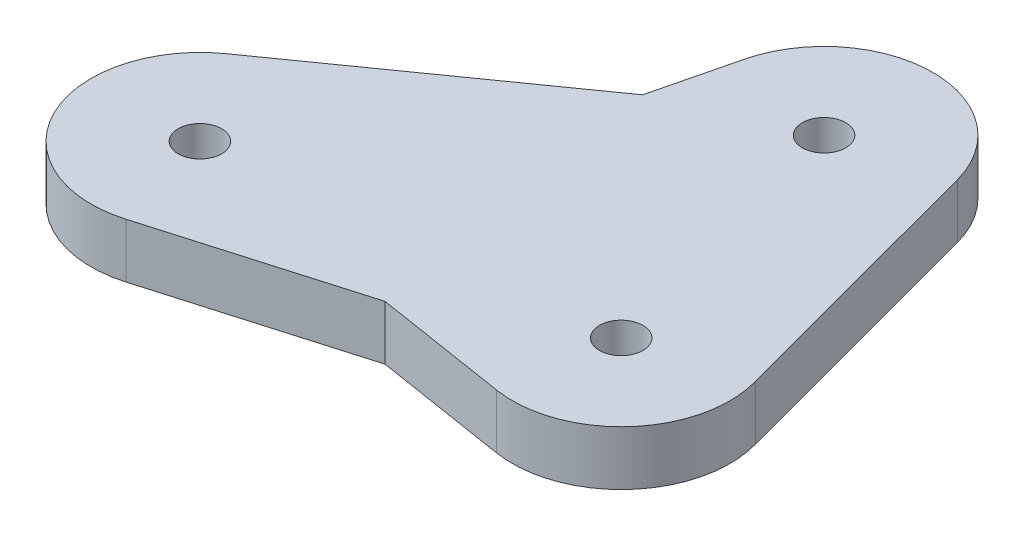
ISO-10303-21;
HEADER;
FILE_DESCRIPTION(('STEP AP214'),'2;1');
FILE_NAME('part.step','',(''),(''),'','','');
FILE_SCHEMA(('AUTOMOTIVE_DESIGN { 1 0 10303 214 1 1 1 1 }'));
ENDSEC;
DATA;
#1=APPLICATION_CONTEXT('core data for automotive mechanical design processes');
#2=APPLICATION_PROTOCOL_DEFINITION('international standard','automotive_design',2000,#1);
#3=PRODUCT_CONTEXT('',#1,'mechanical');
#4=PRODUCT('Part','Part','',(#3));
#5=PRODUCT_RELATED_PRODUCT_CATEGORY('part','',(#4));
#6=PRODUCT_DEFINITION_FORMATION('','',#4);
#7=PRODUCT_DEFINITION_CONTEXT('part definition',#1,'design');
#8=PRODUCT_DEFINITION('design','',#6,#7);
#9=PRODUCT_DEFINITION_SHAPE('','',#8);
#10=(LENGTH_UNIT() NAMED_UNIT(*) SI_UNIT(.MILLI.,.METRE.));
#11=(NAMED_UNIT(*) PLANE_ANGLE_UNIT() SI_UNIT($,.RADIAN.));
#12=(NAMED_UNIT(*) SI_UNIT($,.STERADIAN.) SOLID_ANGLE_UNIT());
#13=UNCERTAINTY_MEASURE_WITH_UNIT(LENGTH_MEASURE(1.E-05),#10,'distance_accuracy_value','');
#14=(GEOMETRIC_REPRESENTATION_CONTEXT(3) GLOBAL_UNCERTAINTY_ASSIGNED_CONTEXT((#13)) GLOBAL_UNIT_ASSIGNED_CONTEXT((#10,
#11,#12)) REPRESENTATION_CONTEXT('',''));
#15=CARTESIAN_POINT('',(0.,0.,0.));
#16=DIRECTION('',(0.,0.,1.));
#17=DIRECTION('',(1.,0.,0.));
#18=AXIS2_PLACEMENT_3D('',#15,#16,#17);
#19=CARTESIAN_POINT('',(-12.4473232729435,5.,7.18830522239326));
#20=DIRECTION('',(0.,-1.,0.));
#21=DIRECTION('',(0.,0.,-1.));
#22=AXIS2_PLACEMENT_3D('',#19,#20,#21);
#23=CYLINDRICAL_SURFACE('',#22,10.);
#24=CARTESIAN_POINT('',(-12.4473232729435,0.,7.18830522239326));
#25=DIRECTION('',(0.,1.,0.));
#26=DIRECTION('',(0.,0.,1.));
#27=AXIS2_PLACEMENT_3D('',#24,#25,#26);
#28=CIRCLE('',#27,10.);
#29=CARTESIAN_POINT('',(-18.2247814038649,0.,-0.973862231503444));
#30=VERTEX_POINT('',#29);
#31=CARTESIAN_POINT('',(-9.6548454678287,0.,16.7904959988745));
#32=VERTEX_POINT('',#31);
#33=EDGE_CURVE('E153',#30,#32,#28,.T.);
#34=ORIENTED_EDGE('',*,*,#33,.T.);
#35=DIRECTION('',(0.,-1.,0.));
#36=VECTOR('',#35,1.);
#37=CARTESIAN_POINT('',(-9.6548454678287,5.,16.7904959988745));
#38=LINE('',#37,#36);
#39=CARTESIAN_POINT('',(-9.6548454678287,5.,16.7904959988745));
#40=VERTEX_POINT('',#39);
#41=EDGE_CURVE('E11',#40,#32,#38,.T.);
#42=ORIENTED_EDGE('',*,*,#41,.F.);
#43=CARTESIAN_POINT('',(-12.4473232729435,5.,7.18830522239326));
#44=DIRECTION('',(0.,1.,0.));
#45=DIRECTION('',(0.,0.,1.));
#46=AXIS2_PLACEMENT_3D('',#43,#44,#45);
#47=CIRCLE('',#46,10.);
#48=CARTESIAN_POINT('',(-18.2247814038649,5.,-0.973862231503444));
#49=VERTEX_POINT('',#48);
#50=EDGE_CURVE('E94',#49,#40,#47,.T.);
#51=ORIENTED_EDGE('',*,*,#50,.F.);
#52=DIRECTION('',(0.,-1.,0.));
#53=VECTOR('',#52,1.);
#54=CARTESIAN_POINT('',(-18.2247814038649,5.,-0.973862231503444));
#55=LINE('',#54,#53);
#56=EDGE_CURVE('E152',#49,#30,#55,.T.);
#57=ORIENTED_EDGE('',*,*,#56,.T.);
#58=EDGE_LOOP('',(#34,#42,#51,#57));
#59=FACE_BOUND('',#58,.T.);
#60=ADVANCED_FACE('F41',(#59),#23,.T.);
#61=CARTESIAN_POINT('',(3.7493092705173,5.,12.8923434340623));
#62=DIRECTION('',(0.279247780511482,0.,0.960219077648122));
#63=DIRECTION('',(0.960219077648123,0.,-0.279247780511482));
#64=AXIS2_PLACEMENT_3D('',#61,#62,#63);
#65=PLANE('',#64);
#66=DIRECTION('',(-0.960219077648123,0.,0.279247780511482));
#67=VECTOR('',#66,1.);
#68=CARTESIAN_POINT('',(3.7493092705173,0.,12.8923434340623));
#69=LINE('',#68,#67);
#70=CARTESIAN_POINT('',(8.80106118643741,0.,11.4232094176142));
#71=VERTEX_POINT('',#70);
#72=EDGE_CURVE('E157',#71,#32,#69,.T.);
#73=ORIENTED_EDGE('',*,*,#72,.F.);
#74=DIRECTION('',(0.,-1.,0.));
#75=VECTOR('',#74,1.);
#76=CARTESIAN_POINT('',(8.80106118643741,5.,11.4232094176142));
#77=LINE('',#76,#75);
#78=CARTESIAN_POINT('',(8.80106118643741,5.,11.4232094176142));
#79=VERTEX_POINT('',#78);
#80=EDGE_CURVE('E50',#79,#71,#77,.T.);
#81=ORIENTED_EDGE('',*,*,#80,.F.);
#82=DIRECTION('',(-0.960219077648123,0.,0.279247780511482));
#83=VECTOR('',#82,1.);
#84=CARTESIAN_POINT('',(3.7493092705173,5.,12.8923434340623));
#85=LINE('',#84,#83);
#86=EDGE_CURVE('E232',#79,#40,#85,.T.);
#87=ORIENTED_EDGE('',*,*,#86,.T.);
#88=ORIENTED_EDGE('',*,*,#41,.T.);
#89=EDGE_LOOP('',(#73,#81,#87,#88));
#90=FACE_BOUND('',#89,.T.);
#91=ADVANCED_FACE('F212',(#90),#65,.T.);
#92=CARTESIAN_POINT('',(-1.55263602270243,5.,9.77939343176249));
#93=DIRECTION('',(-0.156802155329052,0.,0.98763003401282));
#94=DIRECTION('',(0.98763003401282,0.,0.156802155329052));
#95=AXIS2_PLACEMENT_3D('',#92,#93,#94);
#96=PLANE('',#95);
#97=DIRECTION('',(-0.98763003401282,0.,-0.156802155329052));
#98=VECTOR('',#97,1.);
#99=CARTESIAN_POINT('',(-1.55263602270243,0.,9.77939343176249));
#100=LINE('',#99,#98);
#101=CARTESIAN_POINT('',(20.984655173766,0.,13.3575509534877));
#102=VERTEX_POINT('',#101);
#103=EDGE_CURVE('E161',#102,#71,#100,.T.);
#104=ORIENTED_EDGE('',*,*,#103,.F.);
#105=DIRECTION('',(0.,-1.,0.));
#106=VECTOR('',#105,1.);
#107=CARTESIAN_POINT('',(20.984655173766,5.,13.3575509534877));
#108=LINE('',#107,#106);
#109=CARTESIAN_POINT('',(20.984655173766,5.,13.3575509534877));
#110=VERTEX_POINT('',#109);
#111=EDGE_CURVE('E200',#110,#102,#108,.T.);
#112=ORIENTED_EDGE('',*,*,#111,.F.);
#113=DIRECTION('',(-0.98763003401282,0.,-0.156802155329052));
#114=VECTOR('',#113,1.);
#115=CARTESIAN_POINT('',(-1.55263602270243,5.,9.77939343176249));
#116=LINE('',#115,#114);
#117=EDGE_CURVE('E209',#110,#79,#116,.T.);
#118=ORIENTED_EDGE('',*,*,#117,.T.);
#119=ORIENTED_EDGE('',*,*,#80,.T.);
#120=EDGE_LOOP('',(#104,#112,#118,#119));
#121=FACE_BOUND('',#120,.T.);
#122=ADVANCED_FACE('F207',(#121),#96,.T.);
#123=CARTESIAN_POINT('',(22.5526767270565,5.,3.48125061335952));
#124=DIRECTION('',(0.,-1.,0.));
#125=DIRECTION('',(0.,0.,-1.));
#126=AXIS2_PLACEMENT_3D('',#123,#124,#125);
#127=CYLINDRICAL_SURFACE('',#126,10.);
#128=CARTESIAN_POINT('',(22.5526767270565,0.,3.48125061335952));
#129=DIRECTION('',(0.,1.,0.));
#130=DIRECTION('',(0.,0.,1.));
#131=AXIS2_PLACEMENT_3D('',#128,#129,#130);
#132=CIRCLE('',#131,10.);
#133=CARTESIAN_POINT('',(32.174930969157,0.,0.758710751322918));
#134=VERTEX_POINT('',#133);
#135=EDGE_CURVE('E165',#102,#134,#132,.T.);
#136=ORIENTED_EDGE('',*,*,#135,.T.);
#137=DIRECTION('',(0.,-1.,0.));
#138=VECTOR('',#137,1.);
#139=CARTESIAN_POINT('',(32.174930969157,5.,0.758710751322918));
#140=LINE('',#139,#138);
#141=CARTESIAN_POINT('',(32.174930969157,5.,0.758710751322918));
#142=VERTEX_POINT('',#141);
#143=EDGE_CURVE('E196',#142,#134,#140,.T.);
#144=ORIENTED_EDGE('',*,*,#143,.F.);
#145=CARTESIAN_POINT('',(22.5526767270565,5.,3.48125061335952));
#146=DIRECTION('',(0.,1.,0.));
#147=DIRECTION('',(0.,0.,1.));
#148=AXIS2_PLACEMENT_3D('',#145,#146,#147);
#149=CIRCLE('',#148,10.);
#150=EDGE_CURVE('E226',#110,#142,#149,.T.);
#151=ORIENTED_EDGE('',*,*,#150,.F.);
#152=ORIENTED_EDGE('',*,*,#111,.T.);
#153=EDGE_LOOP('',(#136,#144,#151,#152));
#154=FACE_BOUND('',#153,.T.);
#155=ADVANCED_FACE('F221',(#154),#127,.T.);
#156=CARTESIAN_POINT('',(29.8372933137771,5.,-7.9808294838942));
#157=DIRECTION('',(-0.966039450194387,0.,0.258394621979882));
#158=DIRECTION('',(0.258394621979882,0.,0.966039450194387));
#159=AXIS2_PLACEMENT_3D('',#156,#157,#158);
#160=PLANE('',#159);
#161=DIRECTION('',(-0.258394621979882,0.,-0.966039450194387));
#162=VECTOR('',#161,1.);
#163=CARTESIAN_POINT('',(29.8372933137771,0.,-7.9808294838942));
#164=LINE('',#163,#162);
#165=CARTESIAN_POINT('',(25.4064054743133,0.,-24.5462379258775));
#166=VERTEX_POINT('',#165);
#167=EDGE_CURVE('E168',#134,#166,#164,.T.);
#168=ORIENTED_EDGE('',*,*,#167,.T.);
#169=DIRECTION('',(0.,-1.,0.));
#170=VECTOR('',#169,1.);
#171=CARTESIAN_POINT('',(25.4064054743133,5.,-24.5462379258775));
#172=LINE('',#171,#170);
#173=CARTESIAN_POINT('',(25.4064054743133,5.,-24.5462379258775));
#174=VERTEX_POINT('',#173);
#175=EDGE_CURVE('E131',#174,#166,#172,.T.);
#176=ORIENTED_EDGE('',*,*,#175,.F.);
#177=DIRECTION('',(-0.258394621979882,0.,-0.966039450194387));
#178=VECTOR('',#177,1.);
#179=CARTESIAN_POINT('',(29.8372933137771,5.,-7.9808294838942));
#180=LINE('',#179,#178);
#181=EDGE_CURVE('E116',#142,#174,#180,.T.);
#182=ORIENTED_EDGE('',*,*,#181,.F.);
#183=ORIENTED_EDGE('',*,*,#143,.T.);
#184=EDGE_LOOP('',(#168,#176,#182,#183));
#185=FACE_BOUND('',#184,.T.);
#186=ADVANCED_FACE('F224',(#185),#160,.F.);
#187=CARTESIAN_POINT('',(15.7460109723694,5.,-21.9622917060787));
#188=DIRECTION('',(0.,-1.,0.));
#189=DIRECTION('',(0.,0.,-1.));
#190=AXIS2_PLACEMENT_3D('',#187,#188,#189);
#191=CYLINDRICAL_SURFACE('',#190,10.0000000000001);
#192=CARTESIAN_POINT('',(15.7460109723694,0.,-21.9622917060787));
#193=DIRECTION('',(0.,1.,0.));
#194=DIRECTION('',(0.,0.,1.));
#195=AXIS2_PLACEMENT_3D('',#192,#193,#194);
#196=CIRCLE('',#195,10.0000000000001);
#197=CARTESIAN_POINT('',(6.0339202691004,0.,-24.344579298179));
#198=VERTEX_POINT('',#197);
#199=EDGE_CURVE('E126',#166,#198,#196,.T.);
#200=ORIENTED_EDGE('',*,*,#199,.T.);
#201=DIRECTION('',(0.,-1.,0.));
#202=VECTOR('',#201,1.);
#203=CARTESIAN_POINT('',(6.0339202691004,5.,-24.344579298179));
#204=LINE('',#203,#202);
#205=CARTESIAN_POINT('',(6.0339202691004,5.,-24.344579298179));
#206=VERTEX_POINT('',#205);
#207=EDGE_CURVE('E123',#206,#198,#204,.T.);
#208=ORIENTED_EDGE('',*,*,#207,.F.);
#209=CARTESIAN_POINT('',(15.7460109723694,5.,-21.9622917060787));
#210=DIRECTION('',(0.,1.,0.));
#211=DIRECTION('',(0.,0.,1.));
#212=AXIS2_PLACEMENT_3D('',#209,#210,#211);
#213=CIRCLE('',#212,10.0000000000001);
#214=EDGE_CURVE('E109',#174,#206,#213,.T.);
#215=ORIENTED_EDGE('',*,*,#214,.F.);
#216=ORIENTED_EDGE('',*,*,#175,.T.);
#217=EDGE_LOOP('',(#200,#208,#215,#216));
#218=FACE_BOUND('',#217,.T.);
#219=ADVANCED_FACE('F124',(#218),#191,.T.);
#220=CARTESIAN_POINT('',(0.058873892871695,5.,0.0144412309122768));
#221=DIRECTION('',(-0.971209070326903,0.,-0.238228759210036));
#222=DIRECTION('',(-0.238228759210036,0.,0.971209070326903));
#223=AXIS2_PLACEMENT_3D('',#220,#221,#222);
#224=PLANE('',#223);
#225=DIRECTION('',(0.238228759210036,0.,-0.971209070326903));
#226=VECTOR('',#225,1.);
#227=CARTESIAN_POINT('',(0.058873892871695,0.,0.0144412309122768));
#228=LINE('',#227,#226);
#229=CARTESIAN_POINT('',(4.1937110436033,0.,-16.8424292763745));
#230=VERTEX_POINT('',#229);
#231=EDGE_CURVE('E173',#230,#198,#228,.T.);
#232=ORIENTED_EDGE('',*,*,#231,.F.);
#233=DIRECTION('',(0.,-1.,0.));
#234=VECTOR('',#233,1.);
#235=CARTESIAN_POINT('',(4.1937110436033,5.,-16.8424292763745));
#236=LINE('',#235,#234);
#237=CARTESIAN_POINT('',(4.1937110436033,5.,-16.8424292763745));
#238=VERTEX_POINT('',#237);
#239=EDGE_CURVE('E85',#238,#230,#236,.T.);
#240=ORIENTED_EDGE('',*,*,#239,.F.);
#241=DIRECTION('',(0.238228759210036,0.,-0.971209070326903));
#242=VECTOR('',#241,1.);
#243=CARTESIAN_POINT('',(0.058873892871695,5.,0.0144412309122768));
#244=LINE('',#243,#242);
#245=EDGE_CURVE('E114',#238,#206,#244,.T.);
#246=ORIENTED_EDGE('',*,*,#245,.T.);
#247=ORIENTED_EDGE('',*,*,#207,.T.);
#248=EDGE_LOOP('',(#232,#240,#246,#247));
#249=FACE_BOUND('',#248,.T.);
#250=ADVANCED_FACE('F133',(#249),#224,.T.);
#251=CARTESIAN_POINT('',(15.7460109723694,5.,-21.9622917060787));
#252=DIRECTION('',(0.,-1.,0.));
#253=DIRECTION('',(0.,0.,-1.));
#254=AXIS2_PLACEMENT_3D('',#251,#252,#253);
#255=CYLINDRICAL_SURFACE('',#254,2.00000000000006);
#256=CARTESIAN_POINT('',(15.7460109723694,5.,-21.9622917060787));
#257=DIRECTION('',(0.,1.,0.));
#258=DIRECTION('',(0.,0.,1.));
#259=AXIS2_PLACEMENT_3D('',#256,#257,#258);
#260=CIRCLE('',#259,2.00000000000006);
#261=CARTESIAN_POINT('',(15.7460109723694,5.,-19.9622917060786));
#262=VERTEX_POINT('',#261);
#263=EDGE_CURVE('E144',#262,#262,#260,.T.);
#264=ORIENTED_EDGE('',*,*,#263,.T.);
#265=EDGE_LOOP('',(#264));
#266=FACE_BOUND('',#265,.T.);
#267=CARTESIAN_POINT('',(15.7460109723694,0.,-21.9622917060787));
#268=DIRECTION('',(0.,1.,0.));
#269=DIRECTION('',(0.,0.,1.));
#270=AXIS2_PLACEMENT_3D('',#267,#268,#269);
#271=CIRCLE('',#270,2.00000000000006);
#272=CARTESIAN_POINT('',(15.7460109723694,0.,-19.9622917060786));
#273=VERTEX_POINT('',#272);
#274=EDGE_CURVE('E182',#273,#273,#271,.T.);
#275=ORIENTED_EDGE('',*,*,#274,.F.);
#276=EDGE_LOOP('',(#275));
#277=FACE_BOUND('',#276,.T.);
#278=ADVANCED_FACE('F248',(#266,#277),#255,.F.);
#279=CARTESIAN_POINT('',(-12.4473232729435,5.,7.18830522239326));
#280=DIRECTION('',(0.,-1.,0.));
#281=DIRECTION('',(0.,0.,-1.));
#282=AXIS2_PLACEMENT_3D('',#279,#280,#281);
#283=CYLINDRICAL_SURFACE('',#282,2.);
#284=CARTESIAN_POINT('',(-12.4473232729435,5.,7.18830522239326));
#285=DIRECTION('',(0.,1.,0.));
#286=DIRECTION('',(0.,0.,1.));
#287=AXIS2_PLACEMENT_3D('',#284,#285,#286);
#288=CIRCLE('',#287,2.);
#289=CARTESIAN_POINT('',(-12.4473232729435,5.,9.18830522239326));
#290=VERTEX_POINT('',#289);
#291=EDGE_CURVE('E137',#290,#290,#288,.T.);
#292=ORIENTED_EDGE('',*,*,#291,.T.);
#293=EDGE_LOOP('',(#292));
#294=FACE_BOUND('',#293,.T.);
#295=CARTESIAN_POINT('',(-12.4473232729435,0.,7.18830522239326));
#296=DIRECTION('',(0.,1.,0.));
#297=DIRECTION('',(0.,0.,1.));
#298=AXIS2_PLACEMENT_3D('',#295,#296,#297);
#299=CIRCLE('',#298,2.);
#300=CARTESIAN_POINT('',(-12.4473232729435,0.,9.18830522239326));
#301=VERTEX_POINT('',#300);
#302=EDGE_CURVE('E178',#301,#301,#299,.T.);
#303=ORIENTED_EDGE('',*,*,#302,.F.);
#304=EDGE_LOOP('',(#303));
#305=FACE_BOUND('',#304,.T.);
#306=ADVANCED_FACE('F240',(#294,#305),#283,.F.);
#307=CARTESIAN_POINT('',(-6.54249400641306,5.,-9.24298029277847));
#308=DIRECTION('',(0.577745813092137,0.,0.81621674538967));
#309=DIRECTION('',(0.81621674538967,0.,-0.577745813092137));
#310=AXIS2_PLACEMENT_3D('',#307,#308,#309);
#311=PLANE('',#310);
#312=DIRECTION('',(-0.81621674538967,0.,0.577745813092137));
#313=VECTOR('',#312,1.);
#314=CARTESIAN_POINT('',(-6.54249400641306,0.,-9.24298029277847));
#315=LINE('',#314,#313);
#316=EDGE_CURVE('E88',#230,#30,#315,.T.);
#317=ORIENTED_EDGE('',*,*,#316,.T.);
#318=ORIENTED_EDGE('',*,*,#56,.F.);
#319=DIRECTION('',(-0.81621674538967,0.,0.577745813092137));
#320=VECTOR('',#319,1.);
#321=CARTESIAN_POINT('',(-6.54249400641306,5.,-9.24298029277847));
#322=LINE('',#321,#320);
#323=EDGE_CURVE('E58',#238,#49,#322,.T.);
#324=ORIENTED_EDGE('',*,*,#323,.F.);
#325=ORIENTED_EDGE('',*,*,#239,.T.);
#326=EDGE_LOOP('',(#317,#318,#324,#325));
#327=FACE_BOUND('',#326,.T.);
#328=ADVANCED_FACE('F237',(#327),#311,.F.);
#329=CARTESIAN_POINT('',(22.5526767270565,5.,3.48125061335952));
#330=DIRECTION('',(0.,-1.,0.));
#331=DIRECTION('',(0.,0.,-1.));
#332=AXIS2_PLACEMENT_3D('',#329,#330,#331);
#333=CYLINDRICAL_SURFACE('',#332,2.);
#334=CARTESIAN_POINT('',(22.5526767270565,5.,3.48125061335952));
#335=DIRECTION('',(0.,1.,0.));
#336=DIRECTION('',(0.,0.,1.));
#337=AXIS2_PLACEMENT_3D('',#334,#335,#336);
#338=CIRCLE('',#337,2.);
#339=CARTESIAN_POINT('',(22.5526767270565,5.,5.48125061335952));
#340=VERTEX_POINT('',#339);
#341=EDGE_CURVE('E148',#340,#340,#338,.T.);
#342=ORIENTED_EDGE('',*,*,#341,.T.);
#343=EDGE_LOOP('',(#342));
#344=FACE_BOUND('',#343,.T.);
#345=CARTESIAN_POINT('',(22.5526767270565,0.,3.48125061335952));
#346=DIRECTION('',(0.,1.,0.));
#347=DIRECTION('',(0.,0.,1.));
#348=AXIS2_PLACEMENT_3D('',#345,#346,#347);
#349=CIRCLE('',#348,2.);
#350=CARTESIAN_POINT('',(22.5526767270565,0.,5.48125061335952));
#351=VERTEX_POINT('',#350);
#352=EDGE_CURVE('E186',#351,#351,#349,.T.);
#353=ORIENTED_EDGE('',*,*,#352,.F.);
#354=EDGE_LOOP('',(#353));
#355=FACE_BOUND('',#354,.T.);
#356=ADVANCED_FACE('F239',(#344,#355),#333,.F.);
#357=CARTESIAN_POINT('',(0.,5.,0.));
#358=DIRECTION('',(0.,1.,0.));
#359=DIRECTION('',(0.,0.,1.));
#360=AXIS2_PLACEMENT_3D('',#357,#358,#359);
#361=PLANE('',#360);
#362=ORIENTED_EDGE('',*,*,#50,.T.);
#363=ORIENTED_EDGE('',*,*,#86,.F.);
#364=ORIENTED_EDGE('',*,*,#117,.F.);
#365=ORIENTED_EDGE('',*,*,#150,.T.);
#366=ORIENTED_EDGE('',*,*,#181,.T.);
#367=ORIENTED_EDGE('',*,*,#214,.T.);
#368=ORIENTED_EDGE('',*,*,#245,.F.);
#369=ORIENTED_EDGE('',*,*,#323,.T.);
#370=EDGE_LOOP('',(#362,#363,#364,#365,#366,#367,#368,#369));
#371=FACE_BOUND('',#370,.T.);
#372=ORIENTED_EDGE('',*,*,#291,.F.);
#373=EDGE_LOOP('',(#372));
#374=FACE_BOUND('',#373,.T.);
#375=ORIENTED_EDGE('',*,*,#263,.F.);
#376=EDGE_LOOP('',(#375));
#377=FACE_BOUND('',#376,.T.);
#378=ORIENTED_EDGE('',*,*,#341,.F.);
#379=EDGE_LOOP('',(#378));
#380=FACE_BOUND('',#379,.T.);
#381=ADVANCED_FACE('F111',(#371,#374,#377,#380),#361,.T.);
#382=CARTESIAN_POINT('',(0.,0.,0.));
#383=DIRECTION('',(0.,1.,0.));
#384=DIRECTION('',(0.,0.,1.));
#385=AXIS2_PLACEMENT_3D('',#382,#383,#384);
#386=PLANE('',#385);
#387=ORIENTED_EDGE('',*,*,#33,.F.);
#388=ORIENTED_EDGE('',*,*,#316,.F.);
#389=ORIENTED_EDGE('',*,*,#231,.T.);
#390=ORIENTED_EDGE('',*,*,#199,.F.);
#391=ORIENTED_EDGE('',*,*,#167,.F.);
#392=ORIENTED_EDGE('',*,*,#135,.F.);
#393=ORIENTED_EDGE('',*,*,#103,.T.);
#394=ORIENTED_EDGE('',*,*,#72,.T.);
#395=EDGE_LOOP('',(#387,#388,#389,#390,#391,#392,#393,#394));
#396=FACE_BOUND('',#395,.T.);
#397=ORIENTED_EDGE('',*,*,#302,.T.);
#398=EDGE_LOOP('',(#397));
#399=FACE_BOUND('',#398,.T.);
#400=ORIENTED_EDGE('',*,*,#274,.T.);
#401=EDGE_LOOP('',(#400));
#402=FACE_BOUND('',#401,.T.);
#403=ORIENTED_EDGE('',*,*,#352,.T.);
#404=EDGE_LOOP('',(#403));
#405=FACE_BOUND('',#404,.T.);
#406=ADVANCED_FACE('F216',(#396,#399,#402,#405),#386,.F.);
#407=CLOSED_SHELL('',(#60,#91,#122,#155,#186,#219,#250,#278,#306,#328,#356,#381,#406));
#408=MANIFOLD_SOLID_BREP('B2',#407);
#409=ADVANCED_BREP_SHAPE_REPRESENTATION('',(#18,#408),#14);
#410=SHAPE_DEFINITION_REPRESENTATION(#9,#409);
ENDSEC;
END-ISO-10303-21;
